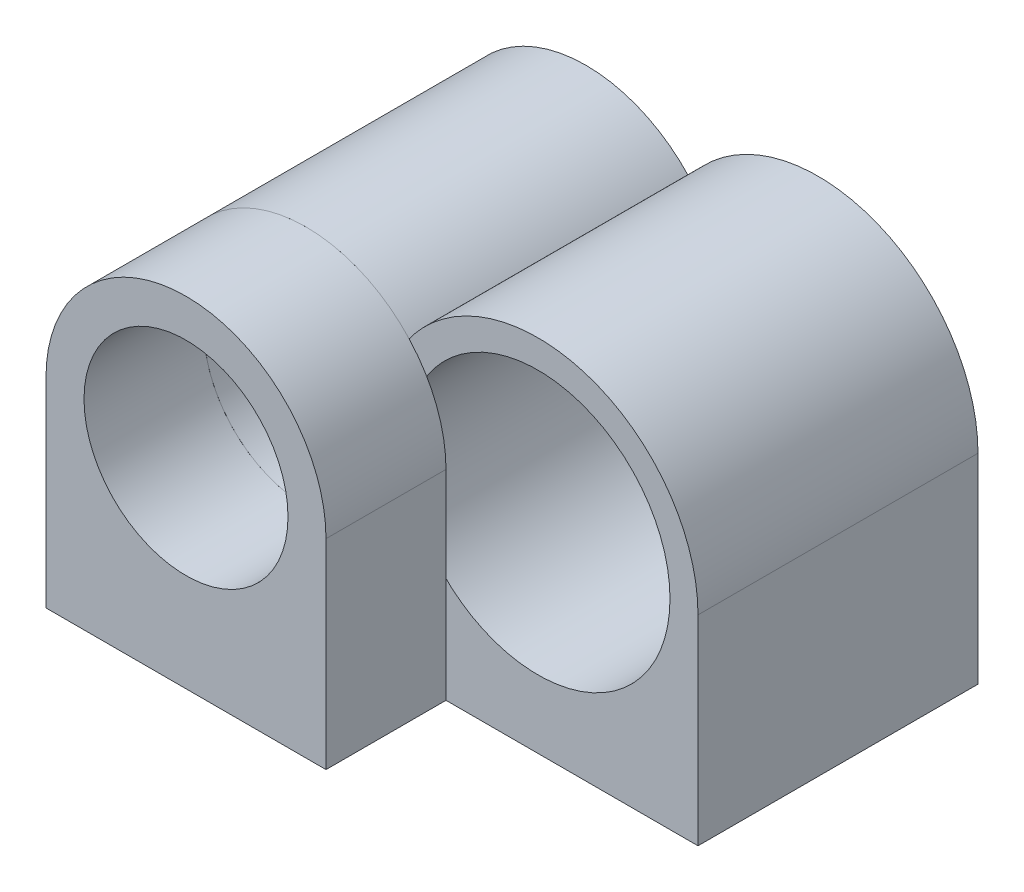
ISO-10303-21;
HEADER;
FILE_DESCRIPTION(('STEP AP214'),'2;1');
FILE_NAME('part.step','',(''),(''),'','','');
FILE_SCHEMA(('AUTOMOTIVE_DESIGN { 1 0 10303 214 1 1 1 1 }'));
ENDSEC;
DATA;
#1=APPLICATION_CONTEXT('core data for automotive mechanical design processes');
#2=APPLICATION_PROTOCOL_DEFINITION('international standard','automotive_design',2000,#1);
#3=PRODUCT_CONTEXT('',#1,'mechanical');
#4=PRODUCT('Part','Part','',(#3));
#5=PRODUCT_RELATED_PRODUCT_CATEGORY('part','',(#4));
#6=PRODUCT_DEFINITION_FORMATION('','',#4);
#7=PRODUCT_DEFINITION_CONTEXT('part definition',#1,'design');
#8=PRODUCT_DEFINITION('design','',#6,#7);
#9=PRODUCT_DEFINITION_SHAPE('','',#8);
#10=(LENGTH_UNIT() NAMED_UNIT(*) SI_UNIT(.MILLI.,.METRE.));
#11=(NAMED_UNIT(*) PLANE_ANGLE_UNIT() SI_UNIT($,.RADIAN.));
#12=(NAMED_UNIT(*) SI_UNIT($,.STERADIAN.) SOLID_ANGLE_UNIT());
#13=UNCERTAINTY_MEASURE_WITH_UNIT(LENGTH_MEASURE(1.E-05),#10,'distance_accuracy_value','');
#14=(GEOMETRIC_REPRESENTATION_CONTEXT(3) GLOBAL_UNCERTAINTY_ASSIGNED_CONTEXT((#13)) GLOBAL_UNIT_ASSIGNED_CONTEXT((#10,
#11,#12)) REPRESENTATION_CONTEXT('',''));
#15=CARTESIAN_POINT('',(0.,0.,0.));
#16=DIRECTION('',(0.,0.,1.));
#17=DIRECTION('',(1.,0.,0.));
#18=AXIS2_PLACEMENT_3D('',#15,#16,#17);
#19=CARTESIAN_POINT('',(0.,0.,0.));
#20=DIRECTION('',(0.,0.,1.));
#21=DIRECTION('',(1.,0.,0.));
#22=AXIS2_PLACEMENT_3D('',#19,#20,#21);
#23=CYLINDRICAL_SURFACE('',#22,4.);
#24=CARTESIAN_POINT('',(0.,0.,7.));
#25=DIRECTION('',(0.,0.,-1.));
#26=DIRECTION('',(-1.,0.,0.));
#27=AXIS2_PLACEMENT_3D('',#24,#25,#26);
#28=CIRCLE('',#27,4.);
#29=CARTESIAN_POINT('',(-3.71875,1.47339690426579,7.));
#30=VERTEX_POINT('',#29);
#31=CARTESIAN_POINT('',(-3.22327586206897,2.36864786682267,7.));
#32=VERTEX_POINT('',#31);
#33=EDGE_CURVE('E151',#30,#32,#28,.T.);
#34=ORIENTED_EDGE('',*,*,#33,.F.);
#35=DIRECTION('',(0.,0.,1.));
#36=VECTOR('',#35,1.);
#37=CARTESIAN_POINT('',(-3.71875,1.47339690426579,0.));
#38=LINE('',#37,#36);
#39=CARTESIAN_POINT('',(-3.71875,1.47339690426579,0.));
#40=VERTEX_POINT('',#39);
#41=EDGE_CURVE('E13',#40,#30,#38,.T.);
#42=ORIENTED_EDGE('',*,*,#41,.F.);
#43=CARTESIAN_POINT('',(0.,0.,0.));
#44=DIRECTION('',(0.,0.,-1.));
#45=DIRECTION('',(-1.,0.,0.));
#46=AXIS2_PLACEMENT_3D('',#43,#44,#45);
#47=CIRCLE('',#46,4.);
#48=CARTESIAN_POINT('',(-3.22327586206897,2.36864786682267,0.));
#49=VERTEX_POINT('',#48);
#50=EDGE_CURVE('E162',#40,#49,#47,.T.);
#51=ORIENTED_EDGE('',*,*,#50,.T.);
#52=DIRECTION('',(0.,0.,1.));
#53=VECTOR('',#52,1.);
#54=CARTESIAN_POINT('',(-3.22327586206897,2.36864786682267,0.));
#55=LINE('',#54,#53);
#56=EDGE_CURVE('E115',#49,#32,#55,.T.);
#57=ORIENTED_EDGE('',*,*,#56,.T.);
#58=EDGE_LOOP('',(#34,#42,#51,#57));
#59=FACE_BOUND('',#58,.T.);
#60=ADVANCED_FACE('F70',(#59),#23,.F.);
#61=CARTESIAN_POINT('',(-5.8,0.,0.));
#62=DIRECTION('',(0.,0.,1.));
#63=DIRECTION('',(1.,0.,0.));
#64=AXIS2_PLACEMENT_3D('',#61,#62,#63);
#65=CYLINDRICAL_SURFACE('',#64,2.55);
#66=CARTESIAN_POINT('',(-5.8,0.,7.));
#67=DIRECTION('',(0.,0.,-1.));
#68=DIRECTION('',(-1.,0.,0.));
#69=AXIS2_PLACEMENT_3D('',#66,#67,#68);
#70=CIRCLE('',#69,2.55);
#71=CARTESIAN_POINT('',(-4.,-1.80623918681885,7.));
#72=VERTEX_POINT('',#71);
#73=EDGE_CURVE('E154',#30,#72,#70,.F.);
#74=ORIENTED_EDGE('',*,*,#73,.T.);
#75=DIRECTION('',(0.,0.,1.));
#76=VECTOR('',#75,1.);
#77=CARTESIAN_POINT('',(-4.,-1.80623918681885,0.));
#78=LINE('',#77,#76);
#79=CARTESIAN_POINT('',(-4.,-1.80623918681885,0.));
#80=VERTEX_POINT('',#79);
#81=EDGE_CURVE('E78',#80,#72,#78,.T.);
#82=ORIENTED_EDGE('',*,*,#81,.F.);
#83=CARTESIAN_POINT('',(-5.8,0.,0.));
#84=DIRECTION('',(0.,0.,-1.));
#85=DIRECTION('',(-1.,0.,0.));
#86=AXIS2_PLACEMENT_3D('',#83,#84,#85);
#87=CIRCLE('',#86,2.55);
#88=EDGE_CURVE('E177',#40,#80,#87,.F.);
#89=ORIENTED_EDGE('',*,*,#88,.F.);
#90=ORIENTED_EDGE('',*,*,#41,.T.);
#91=EDGE_LOOP('',(#74,#82,#89,#90));
#92=FACE_BOUND('',#91,.T.);
#93=ADVANCED_FACE('F180',(#92),#65,.F.);
#94=CARTESIAN_POINT('',(-4.,0.,0.));
#95=DIRECTION('',(-1.,0.,0.));
#96=DIRECTION('',(0.,-1.,0.));
#97=AXIS2_PLACEMENT_3D('',#94,#95,#96);
#98=PLANE('',#97);
#99=DIRECTION('',(0.,-1.,0.));
#100=VECTOR('',#99,1.);
#101=CARTESIAN_POINT('',(-4.,0.,7.));
#102=LINE('',#101,#100);
#103=CARTESIAN_POINT('',(-4.,-5.,7.));
#104=VERTEX_POINT('',#103);
#105=EDGE_CURVE('E156',#72,#104,#102,.T.);
#106=ORIENTED_EDGE('',*,*,#105,.T.);
#107=DIRECTION('',(0.,0.,1.));
#108=VECTOR('',#107,1.);
#109=CARTESIAN_POINT('',(-4.,-5.,0.));
#110=LINE('',#109,#108);
#111=CARTESIAN_POINT('',(-4.,-5.,0.));
#112=VERTEX_POINT('',#111);
#113=EDGE_CURVE('E143',#112,#104,#110,.T.);
#114=ORIENTED_EDGE('',*,*,#113,.F.);
#115=DIRECTION('',(0.,-1.,0.));
#116=VECTOR('',#115,1.);
#117=CARTESIAN_POINT('',(-4.,0.,0.));
#118=LINE('',#117,#116);
#119=EDGE_CURVE('E134',#80,#112,#118,.T.);
#120=ORIENTED_EDGE('',*,*,#119,.F.);
#121=ORIENTED_EDGE('',*,*,#81,.T.);
#122=EDGE_LOOP('',(#106,#114,#120,#121));
#123=FACE_BOUND('',#122,.T.);
#124=ADVANCED_FACE('F169',(#123),#98,.F.);
#125=CARTESIAN_POINT('',(0.,-5.,0.));
#126=DIRECTION('',(0.,1.,0.));
#127=DIRECTION('',(0.,0.,1.));
#128=AXIS2_PLACEMENT_3D('',#125,#126,#127);
#129=PLANE('',#128);
#130=DIRECTION('',(-1.,0.,0.));
#131=VECTOR('',#130,1.);
#132=CARTESIAN_POINT('',(0.,-5.,7.));
#133=LINE('',#132,#131);
#134=CARTESIAN_POINT('',(-9.3,-5.,7.));
#135=VERTEX_POINT('',#134);
#136=EDGE_CURVE('E142',#104,#135,#133,.T.);
#137=ORIENTED_EDGE('',*,*,#136,.T.);
#138=DIRECTION('',(0.,0.,1.));
#139=VECTOR('',#138,1.);
#140=CARTESIAN_POINT('',(-9.3,-5.,0.));
#141=LINE('',#140,#139);
#142=CARTESIAN_POINT('',(-9.3,-5.,0.));
#143=VERTEX_POINT('',#142);
#144=EDGE_CURVE('E139',#143,#135,#141,.T.);
#145=ORIENTED_EDGE('',*,*,#144,.F.);
#146=DIRECTION('',(-1.,0.,0.));
#147=VECTOR('',#146,1.);
#148=CARTESIAN_POINT('',(0.,-5.,0.));
#149=LINE('',#148,#147);
#150=EDGE_CURVE('E128',#112,#143,#149,.T.);
#151=ORIENTED_EDGE('',*,*,#150,.F.);
#152=ORIENTED_EDGE('',*,*,#113,.T.);
#153=EDGE_LOOP('',(#137,#145,#151,#152));
#154=FACE_BOUND('',#153,.T.);
#155=ADVANCED_FACE('F140',(#154),#129,.F.);
#156=CARTESIAN_POINT('',(-9.3,0.,0.));
#157=DIRECTION('',(1.,0.,0.));
#158=DIRECTION('',(0.,0.,-1.));
#159=AXIS2_PLACEMENT_3D('',#156,#157,#158);
#160=PLANE('',#159);
#161=DIRECTION('',(0.,1.,0.));
#162=VECTOR('',#161,1.);
#163=CARTESIAN_POINT('',(-9.3,0.,7.));
#164=LINE('',#163,#162);
#165=CARTESIAN_POINT('',(-9.3,0.,7.));
#166=VERTEX_POINT('',#165);
#167=EDGE_CURVE('E108',#135,#166,#164,.T.);
#168=ORIENTED_EDGE('',*,*,#167,.T.);
#169=DIRECTION('',(0.,0.,1.));
#170=VECTOR('',#169,1.);
#171=CARTESIAN_POINT('',(-9.3,0.,0.));
#172=LINE('',#171,#170);
#173=CARTESIAN_POINT('',(-9.3,0.,0.));
#174=VERTEX_POINT('',#173);
#175=EDGE_CURVE('E144',#174,#166,#172,.T.);
#176=ORIENTED_EDGE('',*,*,#175,.F.);
#177=DIRECTION('',(0.,1.,0.));
#178=VECTOR('',#177,1.);
#179=CARTESIAN_POINT('',(-9.3,0.,0.));
#180=LINE('',#179,#178);
#181=EDGE_CURVE('E132',#143,#174,#180,.T.);
#182=ORIENTED_EDGE('',*,*,#181,.F.);
#183=ORIENTED_EDGE('',*,*,#144,.T.);
#184=EDGE_LOOP('',(#168,#176,#182,#183));
#185=FACE_BOUND('',#184,.T.);
#186=ADVANCED_FACE('F146',(#185),#160,.F.);
#187=CARTESIAN_POINT('',(-5.8,0.,0.));
#188=DIRECTION('',(0.,0.,1.));
#189=DIRECTION('',(1.,0.,0.));
#190=AXIS2_PLACEMENT_3D('',#187,#188,#189);
#191=CYLINDRICAL_SURFACE('',#190,3.5);
#192=CARTESIAN_POINT('',(-5.8,0.,7.));
#193=DIRECTION('',(0.,0.,-1.));
#194=DIRECTION('',(-1.,0.,0.));
#195=AXIS2_PLACEMENT_3D('',#192,#193,#194);
#196=CIRCLE('',#195,3.5);
#197=EDGE_CURVE('E160',#166,#32,#196,.T.);
#198=ORIENTED_EDGE('',*,*,#197,.T.);
#199=ORIENTED_EDGE('',*,*,#56,.F.);
#200=CARTESIAN_POINT('',(-5.8,0.,0.));
#201=DIRECTION('',(0.,0.,-1.));
#202=DIRECTION('',(-1.,0.,0.));
#203=AXIS2_PLACEMENT_3D('',#200,#201,#202);
#204=CIRCLE('',#203,3.5);
#205=EDGE_CURVE('E86',#174,#49,#204,.T.);
#206=ORIENTED_EDGE('',*,*,#205,.F.);
#207=ORIENTED_EDGE('',*,*,#175,.T.);
#208=EDGE_LOOP('',(#198,#199,#206,#207));
#209=FACE_BOUND('',#208,.T.);
#210=ADVANCED_FACE('F176',(#209),#191,.T.);
#211=CARTESIAN_POINT('',(0.,0.,0.));
#212=DIRECTION('',(0.,0.,-1.));
#213=DIRECTION('',(-1.,0.,0.));
#214=AXIS2_PLACEMENT_3D('',#211,#212,#213);
#215=PLANE('',#214);
#216=ORIENTED_EDGE('',*,*,#50,.F.);
#217=ORIENTED_EDGE('',*,*,#88,.T.);
#218=ORIENTED_EDGE('',*,*,#119,.T.);
#219=ORIENTED_EDGE('',*,*,#150,.T.);
#220=ORIENTED_EDGE('',*,*,#181,.T.);
#221=ORIENTED_EDGE('',*,*,#205,.T.);
#222=EDGE_LOOP('',(#216,#217,#218,#219,#220,#221));
#223=FACE_BOUND('',#222,.T.);
#224=ADVANCED_FACE('F130',(#223),#215,.T.);
#225=CARTESIAN_POINT('',(0.,0.,7.));
#226=DIRECTION('',(0.,0.,-1.));
#227=DIRECTION('',(-1.,0.,0.));
#228=AXIS2_PLACEMENT_3D('',#225,#226,#227);
#229=PLANE('',#228);
#230=ORIENTED_EDGE('',*,*,#33,.T.);
#231=ORIENTED_EDGE('',*,*,#197,.F.);
#232=ORIENTED_EDGE('',*,*,#167,.F.);
#233=ORIENTED_EDGE('',*,*,#136,.F.);
#234=ORIENTED_EDGE('',*,*,#105,.F.);
#235=ORIENTED_EDGE('',*,*,#73,.F.);
#236=EDGE_LOOP('',(#230,#231,#232,#233,#234,#235));
#237=FACE_BOUND('',#236,.T.);
#238=ADVANCED_FACE('F173',(#237),#229,.F.);
#239=CLOSED_SHELL('',(#60,#93,#124,#155,#186,#210,#224,#238));
#240=MANIFOLD_SOLID_BREP('B2',#239);
#241=CARTESIAN_POINT('',(-5.8,0.,10.));
#242=DIRECTION('',(0.,0.,1.));
#243=DIRECTION('',(1.,0.,0.));
#244=AXIS2_PLACEMENT_3D('',#241,#242,#243);
#245=PLANE('',#244);
#246=DIRECTION('',(0.,-1.,0.));
#247=VECTOR('',#246,1.);
#248=CARTESIAN_POINT('',(-2.3,0.,10.));
#249=LINE('',#248,#247);
#250=CARTESIAN_POINT('',(-2.3,0.,10.));
#251=VERTEX_POINT('',#250);
#252=CARTESIAN_POINT('',(-2.3,-5.,10.));
#253=VERTEX_POINT('',#252);
#254=EDGE_CURVE('E320',#251,#253,#249,.T.);
#255=ORIENTED_EDGE('',*,*,#254,.F.);
#256=CARTESIAN_POINT('',(-5.8,0.,10.));
#257=DIRECTION('',(0.,0.,1.));
#258=DIRECTION('',(1.,0.,0.));
#259=AXIS2_PLACEMENT_3D('',#256,#257,#258);
#260=CIRCLE('',#259,3.5);
#261=CARTESIAN_POINT('',(-9.3,0.,10.));
#262=VERTEX_POINT('',#261);
#263=EDGE_CURVE('E324',#251,#262,#260,.T.);
#264=ORIENTED_EDGE('',*,*,#263,.T.);
#265=DIRECTION('',(0.,-1.,0.));
#266=VECTOR('',#265,1.);
#267=CARTESIAN_POINT('',(-9.3,0.,10.));
#268=LINE('',#267,#266);
#269=CARTESIAN_POINT('',(-9.3,-5.,10.));
#270=VERTEX_POINT('',#269);
#271=EDGE_CURVE('E319',#262,#270,#268,.T.);
#272=ORIENTED_EDGE('',*,*,#271,.T.);
#273=DIRECTION('',(-1.,0.,0.));
#274=VECTOR('',#273,1.);
#275=CARTESIAN_POINT('',(-2.3,-5.,10.));
#276=LINE('',#275,#274);
#277=EDGE_CURVE('E311',#253,#270,#276,.T.);
#278=ORIENTED_EDGE('',*,*,#277,.F.);
#279=EDGE_LOOP('',(#255,#264,#272,#278));
#280=FACE_BOUND('',#279,.T.);
#281=CARTESIAN_POINT('',(-5.8,0.,10.));
#282=DIRECTION('',(0.,0.,1.));
#283=DIRECTION('',(1.,0.,0.));
#284=AXIS2_PLACEMENT_3D('',#281,#282,#283);
#285=CIRCLE('',#284,2.55);
#286=CARTESIAN_POINT('',(-3.25,0.,10.));
#287=VERTEX_POINT('',#286);
#288=EDGE_CURVE('E339',#287,#287,#285,.T.);
#289=ORIENTED_EDGE('',*,*,#288,.F.);
#290=EDGE_LOOP('',(#289));
#291=FACE_BOUND('',#290,.T.);
#292=ADVANCED_FACE('F267',(#280,#291),#245,.T.);
#293=CARTESIAN_POINT('',(-5.8,0.,7.));
#294=DIRECTION('',(0.,0.,1.));
#295=DIRECTION('',(1.,0.,0.));
#296=AXIS2_PLACEMENT_3D('',#293,#294,#295);
#297=PLANE('',#296);
#298=DIRECTION('',(0.,-1.,0.));
#299=VECTOR('',#298,1.);
#300=CARTESIAN_POINT('',(-2.3,0.,7.));
#301=LINE('',#300,#299);
#302=CARTESIAN_POINT('',(-2.3,0.,7.));
#303=VERTEX_POINT('',#302);
#304=CARTESIAN_POINT('',(-2.3,-5.,7.));
#305=VERTEX_POINT('',#304);
#306=EDGE_CURVE('E336',#303,#305,#301,.T.);
#307=ORIENTED_EDGE('',*,*,#306,.T.);
#308=DIRECTION('',(1.,0.,0.));
#309=VECTOR('',#308,1.);
#310=CARTESIAN_POINT('',(-9.3,-5.,7.));
#311=LINE('',#310,#309);
#312=CARTESIAN_POINT('',(-9.3,-5.,7.));
#313=VERTEX_POINT('',#312);
#314=EDGE_CURVE('E334',#313,#305,#311,.T.);
#315=ORIENTED_EDGE('',*,*,#314,.F.);
#316=DIRECTION('',(0.,-1.,0.));
#317=VECTOR('',#316,1.);
#318=CARTESIAN_POINT('',(-9.3,0.,7.));
#319=LINE('',#318,#317);
#320=CARTESIAN_POINT('',(-9.3,0.,7.));
#321=VERTEX_POINT('',#320);
#322=EDGE_CURVE('E329',#321,#313,#319,.T.);
#323=ORIENTED_EDGE('',*,*,#322,.F.);
#324=CARTESIAN_POINT('',(-5.8,0.,7.));
#325=DIRECTION('',(0.,0.,1.));
#326=DIRECTION('',(1.,0.,0.));
#327=AXIS2_PLACEMENT_3D('',#324,#325,#326);
#328=CIRCLE('',#327,3.5);
#329=EDGE_CURVE('E301',#303,#321,#328,.T.);
#330=ORIENTED_EDGE('',*,*,#329,.F.);
#331=EDGE_LOOP('',(#307,#315,#323,#330));
#332=FACE_BOUND('',#331,.T.);
#333=CARTESIAN_POINT('',(-5.8,0.,7.));
#334=DIRECTION('',(0.,0.,1.));
#335=DIRECTION('',(1.,0.,0.));
#336=AXIS2_PLACEMENT_3D('',#333,#334,#335);
#337=CIRCLE('',#336,2.55);
#338=CARTESIAN_POINT('',(-3.25,0.,7.));
#339=VERTEX_POINT('',#338);
#340=EDGE_CURVE('E342',#339,#339,#337,.T.);
#341=ORIENTED_EDGE('',*,*,#340,.T.);
#342=EDGE_LOOP('',(#341));
#343=FACE_BOUND('',#342,.T.);
#344=ADVANCED_FACE('F351',(#332,#343),#297,.F.);
#345=CARTESIAN_POINT('',(-2.3,0.,10.));
#346=DIRECTION('',(1.,0.,0.));
#347=DIRECTION('',(0.,1.,0.));
#348=AXIS2_PLACEMENT_3D('',#345,#346,#347);
#349=PLANE('',#348);
#350=ORIENTED_EDGE('',*,*,#306,.F.);
#351=DIRECTION('',(0.,0.,-1.));
#352=VECTOR('',#351,1.);
#353=CARTESIAN_POINT('',(-2.3,0.,10.));
#354=LINE('',#353,#352);
#355=EDGE_CURVE('E68',#251,#303,#354,.T.);
#356=ORIENTED_EDGE('',*,*,#355,.F.);
#357=ORIENTED_EDGE('',*,*,#254,.T.);
#358=DIRECTION('',(0.,0.,-1.));
#359=VECTOR('',#358,1.);
#360=CARTESIAN_POINT('',(-2.3,-5.,10.));
#361=LINE('',#360,#359);
#362=EDGE_CURVE('E271',#253,#305,#361,.T.);
#363=ORIENTED_EDGE('',*,*,#362,.T.);
#364=EDGE_LOOP('',(#350,#356,#357,#363));
#365=FACE_BOUND('',#364,.T.);
#366=ADVANCED_FACE('F269',(#365),#349,.T.);
#367=CARTESIAN_POINT('',(-5.8,0.,10.));
#368=DIRECTION('',(0.,0.,-1.));
#369=DIRECTION('',(-1.,0.,0.));
#370=AXIS2_PLACEMENT_3D('',#367,#368,#369);
#371=CYLINDRICAL_SURFACE('',#370,3.5);
#372=ORIENTED_EDGE('',*,*,#329,.T.);
#373=DIRECTION('',(0.,0.,-1.));
#374=VECTOR('',#373,1.);
#375=CARTESIAN_POINT('',(-9.3,0.,10.));
#376=LINE('',#375,#374);
#377=EDGE_CURVE('E277',#262,#321,#376,.T.);
#378=ORIENTED_EDGE('',*,*,#377,.F.);
#379=ORIENTED_EDGE('',*,*,#263,.F.);
#380=ORIENTED_EDGE('',*,*,#355,.T.);
#381=EDGE_LOOP('',(#372,#378,#379,#380));
#382=FACE_BOUND('',#381,.T.);
#383=ADVANCED_FACE('F360',(#382),#371,.T.);
#384=CARTESIAN_POINT('',(-9.3,0.,10.));
#385=DIRECTION('',(1.,0.,0.));
#386=DIRECTION('',(0.,0.,-1.));
#387=AXIS2_PLACEMENT_3D('',#384,#385,#386);
#388=PLANE('',#387);
#389=ORIENTED_EDGE('',*,*,#322,.T.);
#390=DIRECTION('',(0.,0.,-1.));
#391=VECTOR('',#390,1.);
#392=CARTESIAN_POINT('',(-9.3,-5.,10.));
#393=LINE('',#392,#391);
#394=EDGE_CURVE('E315',#270,#313,#393,.T.);
#395=ORIENTED_EDGE('',*,*,#394,.F.);
#396=ORIENTED_EDGE('',*,*,#271,.F.);
#397=ORIENTED_EDGE('',*,*,#377,.T.);
#398=EDGE_LOOP('',(#389,#395,#396,#397));
#399=FACE_BOUND('',#398,.T.);
#400=ADVANCED_FACE('F327',(#399),#388,.F.);
#401=CARTESIAN_POINT('',(-9.3,-5.,10.));
#402=DIRECTION('',(0.,1.,0.));
#403=DIRECTION('',(0.,0.,1.));
#404=AXIS2_PLACEMENT_3D('',#401,#402,#403);
#405=PLANE('',#404);
#406=ORIENTED_EDGE('',*,*,#314,.T.);
#407=ORIENTED_EDGE('',*,*,#362,.F.);
#408=ORIENTED_EDGE('',*,*,#277,.T.);
#409=ORIENTED_EDGE('',*,*,#394,.T.);
#410=EDGE_LOOP('',(#406,#407,#408,#409));
#411=FACE_BOUND('',#410,.T.);
#412=ADVANCED_FACE('F313',(#411),#405,.F.);
#413=CARTESIAN_POINT('',(-5.8,0.,10.));
#414=DIRECTION('',(0.,0.,-1.));
#415=DIRECTION('',(-1.,0.,0.));
#416=AXIS2_PLACEMENT_3D('',#413,#414,#415);
#417=CYLINDRICAL_SURFACE('',#416,2.55);
#418=ORIENTED_EDGE('',*,*,#288,.T.);
#419=EDGE_LOOP('',(#418));
#420=FACE_BOUND('',#419,.T.);
#421=ORIENTED_EDGE('',*,*,#340,.F.);
#422=EDGE_LOOP('',(#421));
#423=FACE_BOUND('',#422,.T.);
#424=ADVANCED_FACE('F348',(#420,#423),#417,.F.);
#425=CLOSED_SHELL('',(#292,#344,#366,#383,#400,#412,#424));
#426=MANIFOLD_SOLID_BREP('B7',#425);
#427=CARTESIAN_POINT('',(0.,0.,7.));
#428=DIRECTION('',(0.,0.,1.));
#429=DIRECTION('',(1.,0.,0.));
#430=AXIS2_PLACEMENT_3D('',#427,#428,#429);
#431=PLANE('',#430);
#432=CARTESIAN_POINT('',(0.,0.,7.));
#433=DIRECTION('',(0.,0.,1.));
#434=DIRECTION('',(1.,0.,0.));
#435=AXIS2_PLACEMENT_3D('',#432,#433,#434);
#436=CIRCLE('',#435,4.);
#437=CARTESIAN_POINT('',(4.,0.,7.));
#438=VERTEX_POINT('',#437);
#439=CARTESIAN_POINT('',(-4.,0.,7.));
#440=VERTEX_POINT('',#439);
#441=EDGE_CURVE('E468',#438,#440,#436,.T.);
#442=ORIENTED_EDGE('',*,*,#441,.T.);
#443=DIRECTION('',(0.,-1.,0.));
#444=VECTOR('',#443,1.);
#445=CARTESIAN_POINT('',(-4.,0.,7.));
#446=LINE('',#445,#444);
#447=CARTESIAN_POINT('',(-4.,-5.,7.));
#448=VERTEX_POINT('',#447);
#449=EDGE_CURVE('E463',#440,#448,#446,.T.);
#450=ORIENTED_EDGE('',*,*,#449,.T.);
#451=DIRECTION('',(1.,0.,0.));
#452=VECTOR('',#451,1.);
#453=CARTESIAN_POINT('',(-4.,-5.,7.));
#454=LINE('',#453,#452);
#455=CARTESIAN_POINT('',(4.,-5.,7.));
#456=VERTEX_POINT('',#455);
#457=EDGE_CURVE('E466',#448,#456,#454,.T.);
#458=ORIENTED_EDGE('',*,*,#457,.T.);
#459=DIRECTION('',(0.,1.,0.));
#460=VECTOR('',#459,1.);
#461=CARTESIAN_POINT('',(4.,-5.,7.));
#462=LINE('',#461,#460);
#463=EDGE_CURVE('E433',#456,#438,#462,.T.);
#464=ORIENTED_EDGE('',*,*,#463,.T.);
#465=EDGE_LOOP('',(#442,#450,#458,#464));
#466=FACE_BOUND('',#465,.T.);
#467=CARTESIAN_POINT('',(0.,0.,7.));
#468=DIRECTION('',(0.,0.,1.));
#469=DIRECTION('',(1.,0.,0.));
#470=AXIS2_PLACEMENT_3D('',#467,#468,#469);
#471=CIRCLE('',#470,3.3);
#472=CARTESIAN_POINT('',(-3.3,0.,7.));
#473=VERTEX_POINT('',#472);
#474=EDGE_CURVE('E488',#473,#473,#471,.T.);
#475=ORIENTED_EDGE('',*,*,#474,.F.);
#476=EDGE_LOOP('',(#475));
#477=FACE_BOUND('',#476,.T.);
#478=ADVANCED_FACE('F415',(#466,#477),#431,.T.);
#479=CARTESIAN_POINT('',(0.,0.,0.));
#480=DIRECTION('',(0.,0.,1.));
#481=DIRECTION('',(1.,0.,0.));
#482=AXIS2_PLACEMENT_3D('',#479,#480,#481);
#483=PLANE('',#482);
#484=CARTESIAN_POINT('',(0.,0.,0.));
#485=DIRECTION('',(0.,0.,1.));
#486=DIRECTION('',(1.,0.,0.));
#487=AXIS2_PLACEMENT_3D('',#484,#485,#486);
#488=CIRCLE('',#487,4.);
#489=CARTESIAN_POINT('',(4.,0.,0.));
#490=VERTEX_POINT('',#489);
#491=CARTESIAN_POINT('',(-4.,0.,0.));
#492=VERTEX_POINT('',#491);
#493=EDGE_CURVE('E484',#490,#492,#488,.T.);
#494=ORIENTED_EDGE('',*,*,#493,.F.);
#495=DIRECTION('',(0.,1.,0.));
#496=VECTOR('',#495,1.);
#497=CARTESIAN_POINT('',(4.,-5.,0.));
#498=LINE('',#497,#496);
#499=CARTESIAN_POINT('',(4.,-5.,0.));
#500=VERTEX_POINT('',#499);
#501=EDGE_CURVE('E456',#500,#490,#498,.T.);
#502=ORIENTED_EDGE('',*,*,#501,.F.);
#503=DIRECTION('',(1.,0.,0.));
#504=VECTOR('',#503,1.);
#505=CARTESIAN_POINT('',(-4.,-5.,0.));
#506=LINE('',#505,#504);
#507=CARTESIAN_POINT('',(-4.,-5.,0.));
#508=VERTEX_POINT('',#507);
#509=EDGE_CURVE('E450',#508,#500,#506,.T.);
#510=ORIENTED_EDGE('',*,*,#509,.F.);
#511=DIRECTION('',(0.,-1.,0.));
#512=VECTOR('',#511,1.);
#513=CARTESIAN_POINT('',(-4.,0.,0.));
#514=LINE('',#513,#512);
#515=EDGE_CURVE('E473',#492,#508,#514,.T.);
#516=ORIENTED_EDGE('',*,*,#515,.F.);
#517=EDGE_LOOP('',(#494,#502,#510,#516));
#518=FACE_BOUND('',#517,.T.);
#519=CARTESIAN_POINT('',(0.,0.,0.));
#520=DIRECTION('',(0.,0.,1.));
#521=DIRECTION('',(1.,0.,0.));
#522=AXIS2_PLACEMENT_3D('',#519,#520,#521);
#523=CIRCLE('',#522,3.3);
#524=CARTESIAN_POINT('',(-3.3,0.,0.));
#525=VERTEX_POINT('',#524);
#526=EDGE_CURVE('E506',#525,#525,#523,.T.);
#527=ORIENTED_EDGE('',*,*,#526,.T.);
#528=EDGE_LOOP('',(#527));
#529=FACE_BOUND('',#528,.T.);
#530=ADVANCED_FACE('F501',(#518,#529),#483,.F.);
#531=CARTESIAN_POINT('',(0.,0.,7.));
#532=DIRECTION('',(0.,0.,-1.));
#533=DIRECTION('',(-1.,0.,0.));
#534=AXIS2_PLACEMENT_3D('',#531,#532,#533);
#535=CYLINDRICAL_SURFACE('',#534,4.);
#536=ORIENTED_EDGE('',*,*,#493,.T.);
#537=DIRECTION('',(0.,0.,-1.));
#538=VECTOR('',#537,1.);
#539=CARTESIAN_POINT('',(-4.,0.,7.));
#540=LINE('',#539,#538);
#541=EDGE_CURVE('E265',#440,#492,#540,.T.);
#542=ORIENTED_EDGE('',*,*,#541,.F.);
#543=ORIENTED_EDGE('',*,*,#441,.F.);
#544=DIRECTION('',(0.,0.,-1.));
#545=VECTOR('',#544,1.);
#546=CARTESIAN_POINT('',(4.,0.,7.));
#547=LINE('',#546,#545);
#548=EDGE_CURVE('E480',#438,#490,#547,.T.);
#549=ORIENTED_EDGE('',*,*,#548,.T.);
#550=EDGE_LOOP('',(#536,#542,#543,#549));
#551=FACE_BOUND('',#550,.T.);
#552=ADVANCED_FACE('F417',(#551),#535,.T.);
#553=CARTESIAN_POINT('',(-4.,0.,7.));
#554=DIRECTION('',(1.,0.,0.));
#555=DIRECTION('',(0.,1.,0.));
#556=AXIS2_PLACEMENT_3D('',#553,#554,#555);
#557=PLANE('',#556);
#558=ORIENTED_EDGE('',*,*,#515,.T.);
#559=DIRECTION('',(0.,0.,-1.));
#560=VECTOR('',#559,1.);
#561=CARTESIAN_POINT('',(-4.,-5.,7.));
#562=LINE('',#561,#560);
#563=EDGE_CURVE('E425',#448,#508,#562,.T.);
#564=ORIENTED_EDGE('',*,*,#563,.F.);
#565=ORIENTED_EDGE('',*,*,#449,.F.);
#566=ORIENTED_EDGE('',*,*,#541,.T.);
#567=EDGE_LOOP('',(#558,#564,#565,#566));
#568=FACE_BOUND('',#567,.T.);
#569=ADVANCED_FACE('F472',(#568),#557,.F.);
#570=CARTESIAN_POINT('',(-4.,-5.,7.));
#571=DIRECTION('',(0.,1.,0.));
#572=DIRECTION('',(0.,0.,1.));
#573=AXIS2_PLACEMENT_3D('',#570,#571,#572);
#574=PLANE('',#573);
#575=ORIENTED_EDGE('',*,*,#509,.T.);
#576=DIRECTION('',(0.,0.,-1.));
#577=VECTOR('',#576,1.);
#578=CARTESIAN_POINT('',(4.,-5.,7.));
#579=LINE('',#578,#577);
#580=EDGE_CURVE('E475',#456,#500,#579,.T.);
#581=ORIENTED_EDGE('',*,*,#580,.F.);
#582=ORIENTED_EDGE('',*,*,#457,.F.);
#583=ORIENTED_EDGE('',*,*,#563,.T.);
#584=EDGE_LOOP('',(#575,#581,#582,#583));
#585=FACE_BOUND('',#584,.T.);
#586=ADVANCED_FACE('F476',(#585),#574,.F.);
#587=CARTESIAN_POINT('',(4.,-5.,7.));
#588=DIRECTION('',(-1.,0.,0.));
#589=DIRECTION('',(0.,-1.,0.));
#590=AXIS2_PLACEMENT_3D('',#587,#588,#589);
#591=PLANE('',#590);
#592=ORIENTED_EDGE('',*,*,#501,.T.);
#593=ORIENTED_EDGE('',*,*,#548,.F.);
#594=ORIENTED_EDGE('',*,*,#463,.F.);
#595=ORIENTED_EDGE('',*,*,#580,.T.);
#596=EDGE_LOOP('',(#592,#593,#594,#595));
#597=FACE_BOUND('',#596,.T.);
#598=ADVANCED_FACE('F498',(#597),#591,.F.);
#599=CARTESIAN_POINT('',(0.,0.,7.));
#600=DIRECTION('',(0.,0.,-1.));
#601=DIRECTION('',(-1.,0.,0.));
#602=AXIS2_PLACEMENT_3D('',#599,#600,#601);
#603=CYLINDRICAL_SURFACE('',#602,3.3);
#604=CARTESIAN_POINT('',(-3.3,0.,7.));
#605=CARTESIAN_POINT('',(-3.3,0.,6.92708333333333));
#606=CARTESIAN_POINT('',(-3.3,0.,6.85416666666667));
#607=CARTESIAN_POINT('',(-3.3,0.,6.70833333333333));
#608=CARTESIAN_POINT('',(-3.3,0.,6.63541666666667));
#609=CARTESIAN_POINT('',(-3.3,0.,6.48958333333333));
#610=CARTESIAN_POINT('',(-3.3,0.,6.41666666666667));
#611=CARTESIAN_POINT('',(-3.3,0.,6.27083333333333));
#612=CARTESIAN_POINT('',(-3.3,0.,6.19791666666667));
#613=CARTESIAN_POINT('',(-3.3,0.,6.05208333333333));
#614=CARTESIAN_POINT('',(-3.3,0.,5.97916666666667));
#615=CARTESIAN_POINT('',(-3.3,0.,5.83333333333333));
#616=CARTESIAN_POINT('',(-3.3,0.,5.76041666666667));
#617=CARTESIAN_POINT('',(-3.3,0.,5.61458333333333));
#618=CARTESIAN_POINT('',(-3.3,0.,5.54166666666667));
#619=CARTESIAN_POINT('',(-3.3,0.,5.39583333333333));
#620=CARTESIAN_POINT('',(-3.3,0.,5.32291666666667));
#621=CARTESIAN_POINT('',(-3.3,0.,5.17708333333333));
#622=CARTESIAN_POINT('',(-3.3,0.,5.10416666666667));
#623=CARTESIAN_POINT('',(-3.3,0.,4.95833333333333));
#624=CARTESIAN_POINT('',(-3.3,0.,4.88541666666667));
#625=CARTESIAN_POINT('',(-3.3,0.,4.73958333333333));
#626=CARTESIAN_POINT('',(-3.3,0.,4.66666666666667));
#627=CARTESIAN_POINT('',(-3.3,0.,4.52083333333333));
#628=CARTESIAN_POINT('',(-3.3,0.,4.44791666666667));
#629=CARTESIAN_POINT('',(-3.3,0.,4.30208333333333));
#630=CARTESIAN_POINT('',(-3.3,0.,4.22916666666667));
#631=CARTESIAN_POINT('',(-3.3,0.,4.08333333333333));
#632=CARTESIAN_POINT('',(-3.3,0.,4.01041666666667));
#633=CARTESIAN_POINT('',(-3.3,0.,3.86458333333333));
#634=CARTESIAN_POINT('',(-3.3,0.,3.79166666666667));
#635=CARTESIAN_POINT('',(-3.3,0.,3.64583333333333));
#636=CARTESIAN_POINT('',(-3.3,0.,3.57291666666667));
#637=CARTESIAN_POINT('',(-3.3,0.,3.42708333333333));
#638=CARTESIAN_POINT('',(-3.3,0.,3.35416666666667));
#639=CARTESIAN_POINT('',(-3.3,0.,3.20833333333333));
#640=CARTESIAN_POINT('',(-3.3,0.,3.13541666666667));
#641=CARTESIAN_POINT('',(-3.3,0.,2.98958333333333));
#642=CARTESIAN_POINT('',(-3.3,0.,2.91666666666667));
#643=CARTESIAN_POINT('',(-3.3,0.,2.77083333333333));
#644=CARTESIAN_POINT('',(-3.3,0.,2.69791666666667));
#645=CARTESIAN_POINT('',(-3.3,0.,2.55208333333333));
#646=CARTESIAN_POINT('',(-3.3,0.,2.47916666666667));
#647=CARTESIAN_POINT('',(-3.3,0.,2.33333333333333));
#648=CARTESIAN_POINT('',(-3.3,0.,2.26041666666667));
#649=CARTESIAN_POINT('',(-3.3,0.,2.11458333333333));
#650=CARTESIAN_POINT('',(-3.3,0.,2.04166666666667));
#651=CARTESIAN_POINT('',(-3.3,0.,1.89583333333333));
#652=CARTESIAN_POINT('',(-3.3,0.,1.82291666666667));
#653=CARTESIAN_POINT('',(-3.3,0.,1.67708333333333));
#654=CARTESIAN_POINT('',(-3.3,0.,1.60416666666667));
#655=CARTESIAN_POINT('',(-3.3,0.,1.45833333333333));
#656=CARTESIAN_POINT('',(-3.3,0.,1.38541666666667));
#657=CARTESIAN_POINT('',(-3.3,0.,1.23958333333333));
#658=CARTESIAN_POINT('',(-3.3,0.,1.16666666666667));
#659=CARTESIAN_POINT('',(-3.3,0.,1.02083333333333));
#660=CARTESIAN_POINT('',(-3.3,0.,0.947916666666666));
#661=CARTESIAN_POINT('',(-3.3,0.,0.802083333333332));
#662=CARTESIAN_POINT('',(-3.3,0.,0.729166666666666));
#663=CARTESIAN_POINT('',(-3.3,0.,0.583333333333332));
#664=CARTESIAN_POINT('',(-3.3,0.,0.510416666666666));
#665=CARTESIAN_POINT('',(-3.3,0.,0.364583333333333));
#666=CARTESIAN_POINT('',(-3.3,0.,0.291666666666666));
#667=CARTESIAN_POINT('',(-3.3,0.,0.145833333333333));
#668=CARTESIAN_POINT('',(-3.3,0.,0.0729166666666657));
#669=CARTESIAN_POINT('',(-3.3,0.,0.));
#670=B_SPLINE_CURVE_WITH_KNOTS('',3,(#604,#605,#606,#607,#608,#609,#610,#611,#612,#613,#614,
#615,#616,#617,#618,#619,#620,#621,#622,#623,#624,#625,#626,#627,#628,#629,#630,#631,#632,#633,
#634,#635,#636,#637,#638,#639,#640,#641,#642,#643,#644,#645,#646,#647,#648,#649,#650,#651,#652,
#653,#654,#655,#656,#657,#658,#659,#660,#661,#662,#663,#664,#665,#666,#667,#668,#669),
.UNSPECIFIED.,.F.,.F.,(4,2,2,2,2,2,2,2,2,2,2,2,2,2,2,2,2,2,2,2,2,2,2,2,2,2,2,2,2,2,2,2,4),(0.,
0.218749999999999,0.4375,0.65625,0.875,1.09375,1.3125,1.53125,1.75,1.96875,2.1875,2.40625,2.625,
2.84375,3.0625,3.28125,3.5,3.71875,3.9375,4.15625,4.375,4.59375,4.8125,5.03125,5.25,5.46875,
5.6875,5.90625,6.125,6.34375,6.5625,6.78125,7.),.UNSPECIFIED.);
#671=EDGE_CURVE('BSEAM514',#473,#525,#670,.T.);
#672=ORIENTED_EDGE('',*,*,#474,.T.);
#673=ORIENTED_EDGE('',*,*,#526,.F.);
#674=ORIENTED_EDGE('',*,*,#671,.T.);
#675=ORIENTED_EDGE('',*,*,#671,.F.);
#676=EDGE_LOOP('',(#672,#674,#673,#675));
#677=FACE_BOUND('',#676,.T.);
#678=ADVANCED_FACE('F514',(#677),#603,.F.);
#679=CLOSED_SHELL('',(#478,#530,#552,#569,#586,#598,#678));
#680=MANIFOLD_SOLID_BREP('B62',#679);
#681=ADVANCED_BREP_SHAPE_REPRESENTATION('',(#18,#240,#426,#680),#14);
#682=SHAPE_DEFINITION_REPRESENTATION(#9,#681);
ENDSEC;
END-ISO-10303-21;
